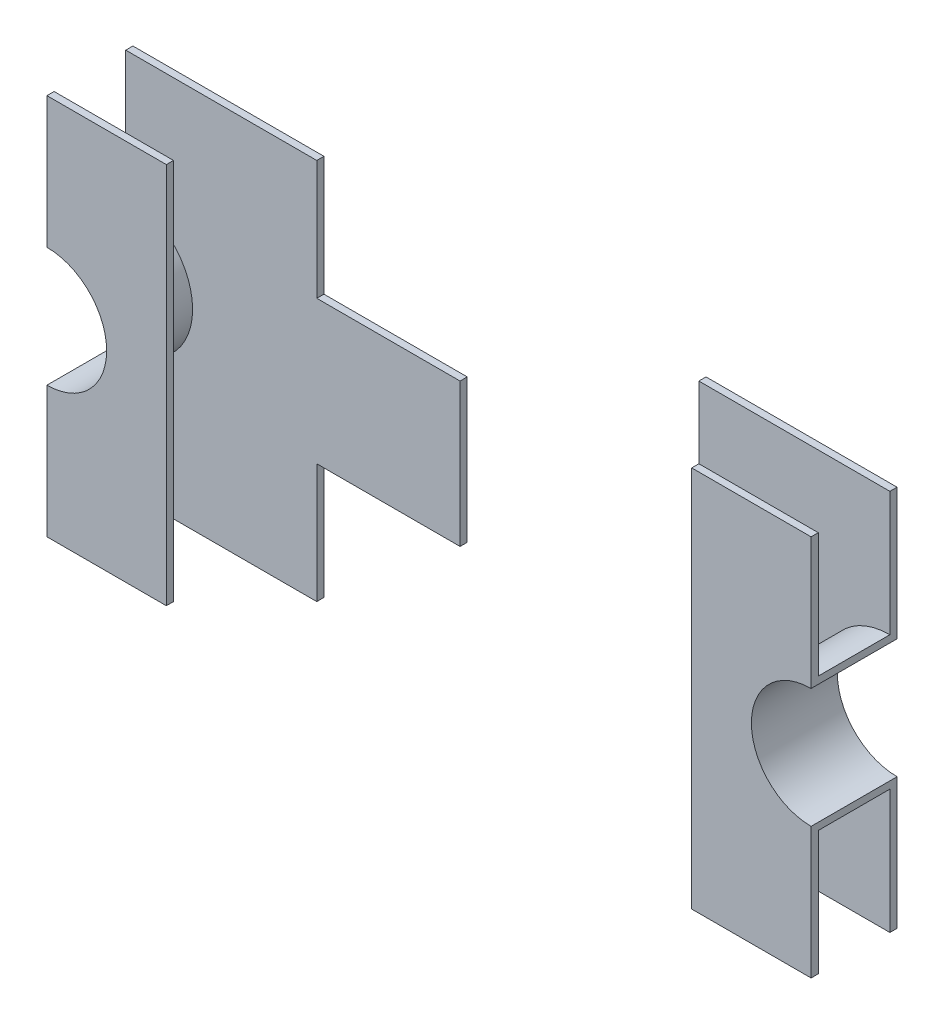
ISO-10303-21;
HEADER;
FILE_DESCRIPTION(('STEP AP214'),'2;1');
FILE_NAME('part.step','',(''),(''),'','','');
FILE_SCHEMA(('AUTOMOTIVE_DESIGN { 1 0 10303 214 1 1 1 1 }'));
ENDSEC;
DATA;
#1=APPLICATION_CONTEXT('core data for automotive mechanical design processes');
#2=APPLICATION_PROTOCOL_DEFINITION('international standard','automotive_design',2000,#1);
#3=PRODUCT_CONTEXT('',#1,'mechanical');
#4=PRODUCT('Part','Part','',(#3));
#5=PRODUCT_RELATED_PRODUCT_CATEGORY('part','',(#4));
#6=PRODUCT_DEFINITION_FORMATION('','',#4);
#7=PRODUCT_DEFINITION_CONTEXT('part definition',#1,'design');
#8=PRODUCT_DEFINITION('design','',#6,#7);
#9=PRODUCT_DEFINITION_SHAPE('','',#8);
#10=(LENGTH_UNIT() NAMED_UNIT(*) SI_UNIT(.MILLI.,.METRE.));
#11=(NAMED_UNIT(*) PLANE_ANGLE_UNIT() SI_UNIT($,.RADIAN.));
#12=(NAMED_UNIT(*) SI_UNIT($,.STERADIAN.) SOLID_ANGLE_UNIT());
#13=UNCERTAINTY_MEASURE_WITH_UNIT(LENGTH_MEASURE(1.E-05),#10,'distance_accuracy_value','');
#14=(GEOMETRIC_REPRESENTATION_CONTEXT(3) GLOBAL_UNCERTAINTY_ASSIGNED_CONTEXT((#13)) GLOBAL_UNIT_ASSIGNED_CONTEXT((#10,
#11,#12)) REPRESENTATION_CONTEXT('',''));
#15=CARTESIAN_POINT('',(0.,0.,0.));
#16=DIRECTION('',(0.,0.,1.));
#17=DIRECTION('',(1.,0.,0.));
#18=AXIS2_PLACEMENT_3D('',#15,#16,#17);
#19=CARTESIAN_POINT('',(0.8,0.,0.18));
#20=DIRECTION('',(1.,0.,0.));
#21=DIRECTION('',(0.,1.,0.));
#22=AXIS2_PLACEMENT_3D('',#19,#20,#21);
#23=PLANE('',#22);
#24=DIRECTION('',(0.,-1.,0.));
#25=VECTOR('',#24,1.);
#26=CARTESIAN_POINT('',(0.8,-0.134798527268,0.01499999999243));
#27=LINE('',#26,#25);
#28=CARTESIAN_POINT('',(0.8,-0.14,0.01499999999243));
#29=VERTEX_POINT('',#28);
#30=CARTESIAN_POINT('',(0.8,-0.4,0.01499999999243));
#31=VERTEX_POINT('',#30);
#32=EDGE_CURVE('P0_E210',#29,#31,#27,.T.);
#33=ORIENTED_EDGE('',*,*,#32,.T.);
#34=DIRECTION('',(0.,0.,1.));
#35=VECTOR('',#34,1.);
#36=CARTESIAN_POINT('',(0.8,-0.4,0.18));
#37=LINE('',#36,#35);
#38=CARTESIAN_POINT('',(0.8,-0.4,0.));
#39=VERTEX_POINT('',#38);
#40=EDGE_CURVE('P0_E202',#39,#31,#37,.T.);
#41=ORIENTED_EDGE('',*,*,#40,.F.);
#42=DIRECTION('',(0.,1.,0.));
#43=VECTOR('',#42,1.);
#44=CARTESIAN_POINT('',(0.8,0.,0.));
#45=LINE('',#44,#43);
#46=CARTESIAN_POINT('',(0.8,-0.125,0.));
#47=VERTEX_POINT('',#46);
#48=EDGE_CURVE('P0_E11',#39,#47,#45,.T.);
#49=ORIENTED_EDGE('',*,*,#48,.T.);
#50=DIRECTION('',(0.,0.,1.));
#51=VECTOR('',#50,1.);
#52=CARTESIAN_POINT('',(0.8,-0.125,0.18));
#53=LINE('',#52,#51);
#54=CARTESIAN_POINT('',(0.8,-0.125,0.18));
#55=VERTEX_POINT('',#54);
#56=EDGE_CURVE('P0_E197',#47,#55,#53,.T.);
#57=ORIENTED_EDGE('',*,*,#56,.T.);
#58=DIRECTION('',(0.,1.,0.));
#59=VECTOR('',#58,1.);
#60=CARTESIAN_POINT('',(0.8,0.,0.18));
#61=LINE('',#60,#59);
#62=CARTESIAN_POINT('',(0.8,-0.4,0.18));
#63=VERTEX_POINT('',#62);
#64=EDGE_CURVE('P0_E215',#63,#55,#61,.T.);
#65=ORIENTED_EDGE('',*,*,#64,.F.);
#66=DIRECTION('',(0.,0.,1.));
#67=VECTOR('',#66,1.);
#68=CARTESIAN_POINT('',(0.8,-0.4,0.18));
#69=LINE('',#68,#67);
#70=CARTESIAN_POINT('',(0.8,-0.4,0.165));
#71=VERTEX_POINT('',#70);
#72=EDGE_CURVE('P0_E283',#71,#63,#69,.T.);
#73=ORIENTED_EDGE('',*,*,#72,.F.);
#74=DIRECTION('',(0.,1.,0.));
#75=VECTOR('',#74,1.);
#76=CARTESIAN_POINT('',(0.8,0.,0.165));
#77=LINE('',#76,#75);
#78=CARTESIAN_POINT('',(0.8,-0.14,0.165));
#79=VERTEX_POINT('',#78);
#80=EDGE_CURVE('P0_E256',#71,#79,#77,.T.);
#81=ORIENTED_EDGE('',*,*,#80,.T.);
#82=DIRECTION('',(0.,0.,-1.));
#83=VECTOR('',#82,1.);
#84=CARTESIAN_POINT('',(0.8,-0.14,0.01499999999243));
#85=LINE('',#84,#83);
#86=EDGE_CURVE('P0_E177',#79,#29,#85,.T.);
#87=ORIENTED_EDGE('',*,*,#86,.T.);
#88=EDGE_LOOP('',(#33,#41,#49,#57,#65,#73,#81,#87));
#89=FACE_BOUND('',#88,.T.);
#90=ADVANCED_FACE('P0_F17',(#89),#23,.T.);
#91=CARTESIAN_POINT('',(0.8,0.,0.));
#92=DIRECTION('',(0.,0.,-1.));
#93=DIRECTION('',(0.,-1.,0.));
#94=AXIS2_PLACEMENT_3D('',#91,#92,#93);
#95=PLANE('',#94);
#96=CARTESIAN_POINT('',(0.8,0.,0.));
#97=DIRECTION('',(0.,0.,1.));
#98=DIRECTION('',(1.,0.,0.));
#99=AXIS2_PLACEMENT_3D('',#96,#97,#98);
#100=CIRCLE('',#99,0.125);
#101=CARTESIAN_POINT('',(0.8,0.125,0.));
#102=VERTEX_POINT('',#101);
#103=EDGE_CURVE('P0_E201',#102,#47,#100,.T.);
#104=ORIENTED_EDGE('',*,*,#103,.T.);
#105=ORIENTED_EDGE('',*,*,#48,.F.);
#106=DIRECTION('',(1.,0.,0.));
#107=VECTOR('',#106,1.);
#108=CARTESIAN_POINT('',(0.8,-0.4,0.));
#109=LINE('',#108,#107);
#110=CARTESIAN_POINT('',(0.4,-0.4,0.));
#111=VERTEX_POINT('',#110);
#112=EDGE_CURVE('P0_E205',#111,#39,#109,.T.);
#113=ORIENTED_EDGE('',*,*,#112,.F.);
#114=DIRECTION('',(0.,1.,0.));
#115=VECTOR('',#114,1.);
#116=CARTESIAN_POINT('',(0.4,0.,0.));
#117=LINE('',#116,#115);
#118=CARTESIAN_POINT('',(0.4,0.4,0.));
#119=VERTEX_POINT('',#118);
#120=EDGE_CURVE('P0_E20',#111,#119,#117,.T.);
#121=ORIENTED_EDGE('',*,*,#120,.T.);
#122=DIRECTION('',(-1.,0.,0.));
#123=VECTOR('',#122,1.);
#124=CARTESIAN_POINT('',(0.8,0.4,0.));
#125=LINE('',#124,#123);
#126=CARTESIAN_POINT('',(0.8,0.4,0.));
#127=VERTEX_POINT('',#126);
#128=EDGE_CURVE('P0_E231',#127,#119,#125,.T.);
#129=ORIENTED_EDGE('',*,*,#128,.F.);
#130=DIRECTION('',(0.,1.,0.));
#131=VECTOR('',#130,1.);
#132=CARTESIAN_POINT('',(0.8,0.,0.));
#133=LINE('',#132,#131);
#134=EDGE_CURVE('P0_E188',#102,#127,#133,.T.);
#135=ORIENTED_EDGE('',*,*,#134,.F.);
#136=EDGE_LOOP('',(#104,#105,#113,#121,#129,#135));
#137=FACE_BOUND('',#136,.T.);
#138=ADVANCED_FACE('P0_F227',(#137),#95,.T.);
#139=CARTESIAN_POINT('',(0.4,0.,0.));
#140=DIRECTION('',(-1.,0.,0.));
#141=DIRECTION('',(0.,0.,1.));
#142=AXIS2_PLACEMENT_3D('',#139,#140,#141);
#143=PLANE('',#142);
#144=DIRECTION('',(0.,1.,0.));
#145=VECTOR('',#144,1.);
#146=CARTESIAN_POINT('',(0.4,0.,0.01499999999243));
#147=LINE('',#146,#145);
#148=CARTESIAN_POINT('',(0.4,-0.4,0.01499999999243));
#149=VERTEX_POINT('',#148);
#150=CARTESIAN_POINT('',(0.4,0.4,0.01499999999243));
#151=VERTEX_POINT('',#150);
#152=EDGE_CURVE('P0_E211',#149,#151,#147,.T.);
#153=ORIENTED_EDGE('',*,*,#152,.T.);
#154=DIRECTION('',(0.,0.,1.));
#155=VECTOR('',#154,1.);
#156=CARTESIAN_POINT('',(0.4,0.4,-0.547241434602));
#157=LINE('',#156,#155);
#158=EDGE_CURVE('P0_E235',#119,#151,#157,.T.);
#159=ORIENTED_EDGE('',*,*,#158,.F.);
#160=ORIENTED_EDGE('',*,*,#120,.F.);
#161=DIRECTION('',(0.,0.,-1.));
#162=VECTOR('',#161,1.);
#163=CARTESIAN_POINT('',(0.4,-0.4,-0.547241434602));
#164=LINE('',#163,#162);
#165=EDGE_CURVE('P0_E218',#149,#111,#164,.T.);
#166=ORIENTED_EDGE('',*,*,#165,.F.);
#167=EDGE_LOOP('',(#153,#159,#160,#166));
#168=FACE_BOUND('',#167,.T.);
#169=ADVANCED_FACE('P0_F236',(#168),#143,.T.);
#170=CARTESIAN_POINT('',(0.6,-0.4,0.09));
#171=DIRECTION('',(0.,-1.,0.));
#172=DIRECTION('',(0.,0.,-1.));
#173=AXIS2_PLACEMENT_3D('',#170,#171,#172);
#174=PLANE('',#173);
#175=DIRECTION('',(-1.,0.,0.));
#176=VECTOR('',#175,1.);
#177=CARTESIAN_POINT('',(0.696250000004,-0.4,0.01499999999243));
#178=LINE('',#177,#176);
#179=EDGE_CURVE('P0_E206',#31,#149,#178,.T.);
#180=ORIENTED_EDGE('',*,*,#179,.T.);
#181=ORIENTED_EDGE('',*,*,#165,.T.);
#182=ORIENTED_EDGE('',*,*,#112,.T.);
#183=ORIENTED_EDGE('',*,*,#40,.T.);
#184=EDGE_LOOP('',(#180,#181,#182,#183));
#185=FACE_BOUND('',#184,.T.);
#186=ADVANCED_FACE('P0_F226',(#185),#174,.T.);
#187=CARTESIAN_POINT('',(0.4,0.,0.18));
#188=DIRECTION('',(0.,0.,1.));
#189=DIRECTION('',(1.,0.,0.));
#190=AXIS2_PLACEMENT_3D('',#187,#188,#189);
#191=PLANE('',#190);
#192=DIRECTION('',(0.,-1.,0.));
#193=VECTOR('',#192,1.);
#194=CARTESIAN_POINT('',(0.55,0.32830613052,0.18));
#195=LINE('',#194,#193);
#196=CARTESIAN_POINT('',(0.55,0.4,0.18));
#197=VERTEX_POINT('',#196);
#198=CARTESIAN_POINT('',(0.55,-0.4,0.18));
#199=VERTEX_POINT('',#198);
#200=EDGE_CURVE('P0_E242',#197,#199,#195,.T.);
#201=ORIENTED_EDGE('',*,*,#200,.T.);
#202=DIRECTION('',(-1.,0.,0.));
#203=VECTOR('',#202,1.);
#204=CARTESIAN_POINT('',(-0.8,-0.4,0.18));
#205=LINE('',#204,#203);
#206=EDGE_CURVE('P0_E272',#63,#199,#205,.T.);
#207=ORIENTED_EDGE('',*,*,#206,.F.);
#208=ORIENTED_EDGE('',*,*,#64,.T.);
#209=CARTESIAN_POINT('',(0.8,0.,0.18));
#210=DIRECTION('',(0.,0.,-1.));
#211=DIRECTION('',(1.,0.,0.));
#212=AXIS2_PLACEMENT_3D('',#209,#210,#211);
#213=CIRCLE('',#212,0.125);
#214=CARTESIAN_POINT('',(0.8,0.125,0.18));
#215=VERTEX_POINT('',#214);
#216=EDGE_CURVE('P0_E194',#55,#215,#213,.T.);
#217=ORIENTED_EDGE('',*,*,#216,.T.);
#218=DIRECTION('',(0.,1.,0.));
#219=VECTOR('',#218,1.);
#220=CARTESIAN_POINT('',(0.8,0.,0.18));
#221=LINE('',#220,#219);
#222=CARTESIAN_POINT('',(0.8,0.4,0.18));
#223=VERTEX_POINT('',#222);
#224=EDGE_CURVE('P0_E181',#215,#223,#221,.T.);
#225=ORIENTED_EDGE('',*,*,#224,.T.);
#226=DIRECTION('',(1.,0.,0.));
#227=VECTOR('',#226,1.);
#228=CARTESIAN_POINT('',(-0.8,0.4,0.18));
#229=LINE('',#228,#227);
#230=EDGE_CURVE('P0_E141',#197,#223,#229,.T.);
#231=ORIENTED_EDGE('',*,*,#230,.F.);
#232=EDGE_LOOP('',(#201,#207,#208,#217,#225,#231));
#233=FACE_BOUND('',#232,.T.);
#234=ADVANCED_FACE('P0_F271',(#233),#191,.T.);
#235=CARTESIAN_POINT('',(0.4,0.,0.01499999999243));
#236=DIRECTION('',(0.,0.,1.));
#237=DIRECTION('',(1.,0.,0.));
#238=AXIS2_PLACEMENT_3D('',#235,#236,#237);
#239=PLANE('',#238);
#240=CARTESIAN_POINT('',(0.8,0.,0.01499999999243));
#241=DIRECTION('',(0.,0.,1.));
#242=DIRECTION('',(1.,0.,0.));
#243=AXIS2_PLACEMENT_3D('',#240,#241,#242);
#244=CIRCLE('',#243,0.14);
#245=CARTESIAN_POINT('',(0.8,0.14,0.01499999999243));
#246=VERTEX_POINT('',#245);
#247=EDGE_CURVE('P0_E173',#246,#29,#244,.T.);
#248=ORIENTED_EDGE('',*,*,#247,.F.);
#249=DIRECTION('',(0.,-1.,0.));
#250=VECTOR('',#249,1.);
#251=CARTESIAN_POINT('',(0.8,0.134798527268,0.01499999999243));
#252=LINE('',#251,#250);
#253=CARTESIAN_POINT('',(0.8,0.4,0.01499999999243));
#254=VERTEX_POINT('',#253);
#255=EDGE_CURVE('P0_E191',#254,#246,#252,.T.);
#256=ORIENTED_EDGE('',*,*,#255,.F.);
#257=DIRECTION('',(1.,0.,0.));
#258=VECTOR('',#257,1.);
#259=CARTESIAN_POINT('',(-0.785000000016,0.4,0.01499999999243));
#260=LINE('',#259,#258);
#261=EDGE_CURVE('P0_E252',#151,#254,#260,.T.);
#262=ORIENTED_EDGE('',*,*,#261,.F.);
#263=ORIENTED_EDGE('',*,*,#152,.F.);
#264=ORIENTED_EDGE('',*,*,#179,.F.);
#265=ORIENTED_EDGE('',*,*,#32,.F.);
#266=EDGE_LOOP('',(#248,#256,#262,#263,#264,#265));
#267=FACE_BOUND('',#266,.T.);
#268=ADVANCED_FACE('P0_F310',(#267),#239,.T.);
#269=CARTESIAN_POINT('',(0.8,0.,0.18));
#270=DIRECTION('',(0.,0.,-1.));
#271=DIRECTION('',(-1.,0.,0.));
#272=AXIS2_PLACEMENT_3D('',#269,#270,#271);
#273=CYLINDRICAL_SURFACE('',#272,0.125);
#274=DIRECTION('',(0.,0.,-1.));
#275=VECTOR('',#274,1.);
#276=CARTESIAN_POINT('',(0.8,0.125,0.18));
#277=LINE('',#276,#275);
#278=EDGE_CURVE('P0_E184',#215,#102,#277,.T.);
#279=ORIENTED_EDGE('',*,*,#278,.F.);
#280=ORIENTED_EDGE('',*,*,#216,.F.);
#281=ORIENTED_EDGE('',*,*,#56,.F.);
#282=ORIENTED_EDGE('',*,*,#103,.F.);
#283=EDGE_LOOP('',(#279,#280,#281,#282));
#284=FACE_BOUND('',#283,.T.);
#285=ADVANCED_FACE('P0_F304',(#284),#273,.F.);
#286=CARTESIAN_POINT('',(0.8,0.,0.18));
#287=DIRECTION('',(1.,0.,0.));
#288=DIRECTION('',(0.,1.,0.));
#289=AXIS2_PLACEMENT_3D('',#286,#287,#288);
#290=PLANE('',#289);
#291=DIRECTION('',(0.,1.,0.));
#292=VECTOR('',#291,1.);
#293=CARTESIAN_POINT('',(0.8,0.,0.165));
#294=LINE('',#293,#292);
#295=CARTESIAN_POINT('',(0.8,0.14,0.165));
#296=VERTEX_POINT('',#295);
#297=CARTESIAN_POINT('',(0.8,0.4,0.165));
#298=VERTEX_POINT('',#297);
#299=EDGE_CURVE('P0_E148',#296,#298,#294,.T.);
#300=ORIENTED_EDGE('',*,*,#299,.T.);
#301=DIRECTION('',(0.,0.,-1.));
#302=VECTOR('',#301,1.);
#303=CARTESIAN_POINT('',(0.8,0.4,0.18));
#304=LINE('',#303,#302);
#305=EDGE_CURVE('P0_E134',#223,#298,#304,.T.);
#306=ORIENTED_EDGE('',*,*,#305,.F.);
#307=ORIENTED_EDGE('',*,*,#224,.F.);
#308=ORIENTED_EDGE('',*,*,#278,.T.);
#309=ORIENTED_EDGE('',*,*,#134,.T.);
#310=DIRECTION('',(0.,0.,-1.));
#311=VECTOR('',#310,1.);
#312=CARTESIAN_POINT('',(0.8,0.4,0.18));
#313=LINE('',#312,#311);
#314=EDGE_CURVE('P0_E246',#254,#127,#313,.T.);
#315=ORIENTED_EDGE('',*,*,#314,.F.);
#316=ORIENTED_EDGE('',*,*,#255,.T.);
#317=DIRECTION('',(0.,0.,1.));
#318=VECTOR('',#317,1.);
#319=CARTESIAN_POINT('',(0.8,0.14,0.01499999999243));
#320=LINE('',#319,#318);
#321=EDGE_CURVE('P0_E145',#246,#296,#320,.T.);
#322=ORIENTED_EDGE('',*,*,#321,.T.);
#323=EDGE_LOOP('',(#300,#306,#307,#308,#309,#315,#316,#322));
#324=FACE_BOUND('',#323,.T.);
#325=ADVANCED_FACE('P0_F149',(#324),#290,.T.);
#326=CARTESIAN_POINT('',(0.8,0.,0.18));
#327=DIRECTION('',(0.,0.,-1.));
#328=DIRECTION('',(0.,1.,0.));
#329=AXIS2_PLACEMENT_3D('',#326,#327,#328);
#330=CYLINDRICAL_SURFACE('',#329,0.14);
#331=CARTESIAN_POINT('',(0.8,0.,0.16499999999));
#332=DIRECTION('',(0.,0.,1.));
#333=DIRECTION('',(0.,1.,0.));
#334=AXIS2_PLACEMENT_3D('',#331,#332,#333);
#335=CIRCLE('',#334,0.14);
#336=EDGE_CURVE('P0_E155',#296,#79,#335,.T.);
#337=ORIENTED_EDGE('',*,*,#336,.F.);
#338=ORIENTED_EDGE('',*,*,#321,.F.);
#339=ORIENTED_EDGE('',*,*,#247,.T.);
#340=ORIENTED_EDGE('',*,*,#86,.F.);
#341=EDGE_LOOP('',(#337,#338,#339,#340));
#342=FACE_BOUND('',#341,.T.);
#343=ADVANCED_FACE('P0_F312',(#342),#330,.T.);
#344=CARTESIAN_POINT('',(0.6,0.4,0.09));
#345=DIRECTION('',(0.,1.,0.));
#346=DIRECTION('',(1.,0.,0.));
#347=AXIS2_PLACEMENT_3D('',#344,#345,#346);
#348=PLANE('',#347);
#349=DIRECTION('',(-1.,0.,0.));
#350=VECTOR('',#349,1.);
#351=CARTESIAN_POINT('',(0.696250000004,0.4,0.165));
#352=LINE('',#351,#350);
#353=CARTESIAN_POINT('',(0.55,0.4,0.16499999999));
#354=VERTEX_POINT('',#353);
#355=EDGE_CURVE('P0_E139',#298,#354,#352,.T.);
#356=ORIENTED_EDGE('',*,*,#355,.T.);
#357=DIRECTION('',(0.,0.,1.));
#358=VECTOR('',#357,1.);
#359=CARTESIAN_POINT('',(0.55,0.4,0.135));
#360=LINE('',#359,#358);
#361=EDGE_CURVE('P0_E167',#354,#197,#360,.T.);
#362=ORIENTED_EDGE('',*,*,#361,.T.);
#363=ORIENTED_EDGE('',*,*,#230,.T.);
#364=ORIENTED_EDGE('',*,*,#305,.T.);
#365=EDGE_LOOP('',(#356,#362,#363,#364));
#366=FACE_BOUND('',#365,.T.);
#367=ADVANCED_FACE('P0_F136',(#366),#348,.T.);
#368=CARTESIAN_POINT('',(0.785000000016,0.,0.16499999999));
#369=DIRECTION('',(0.,0.,-1.));
#370=DIRECTION('',(0.,-1.,0.));
#371=AXIS2_PLACEMENT_3D('',#368,#369,#370);
#372=PLANE('',#371);
#373=DIRECTION('',(0.,1.,0.));
#374=VECTOR('',#373,1.);
#375=CARTESIAN_POINT('',(0.55,0.32830613052,0.16499999999));
#376=LINE('',#375,#374);
#377=CARTESIAN_POINT('',(0.55,-0.4,0.165));
#378=VERTEX_POINT('',#377);
#379=EDGE_CURVE('P0_E159',#378,#354,#376,.T.);
#380=ORIENTED_EDGE('',*,*,#379,.T.);
#381=ORIENTED_EDGE('',*,*,#355,.F.);
#382=ORIENTED_EDGE('',*,*,#299,.F.);
#383=ORIENTED_EDGE('',*,*,#336,.T.);
#384=ORIENTED_EDGE('',*,*,#80,.F.);
#385=DIRECTION('',(1.,0.,0.));
#386=VECTOR('',#385,1.);
#387=CARTESIAN_POINT('',(0.785000000016,-0.4,0.16499999999));
#388=LINE('',#387,#386);
#389=EDGE_CURVE('P0_E285',#378,#71,#388,.T.);
#390=ORIENTED_EDGE('',*,*,#389,.F.);
#391=EDGE_LOOP('',(#380,#381,#382,#383,#384,#390));
#392=FACE_BOUND('',#391,.T.);
#393=ADVANCED_FACE('P0_F157',(#392),#372,.T.);
#394=CARTESIAN_POINT('',(0.55,0.65661226104,0.18));
#395=DIRECTION('',(1.,0.,0.));
#396=DIRECTION('',(0.,1.,0.));
#397=AXIS2_PLACEMENT_3D('',#394,#395,#396);
#398=PLANE('',#397);
#399=DIRECTION('',(0.,0.,-1.));
#400=VECTOR('',#399,1.);
#401=CARTESIAN_POINT('',(0.55,-0.4,0.135));
#402=LINE('',#401,#400);
#403=EDGE_CURVE('P0_E267',#199,#378,#402,.T.);
#404=ORIENTED_EDGE('',*,*,#403,.F.);
#405=ORIENTED_EDGE('',*,*,#200,.F.);
#406=ORIENTED_EDGE('',*,*,#361,.F.);
#407=ORIENTED_EDGE('',*,*,#379,.F.);
#408=EDGE_LOOP('',(#404,#405,#406,#407));
#409=FACE_BOUND('',#408,.T.);
#410=ADVANCED_FACE('P0_F265',(#409),#398,.F.);
#411=CARTESIAN_POINT('',(0.6,0.4,0.09));
#412=DIRECTION('',(0.,1.,0.));
#413=DIRECTION('',(1.,0.,0.));
#414=AXIS2_PLACEMENT_3D('',#411,#412,#413);
#415=PLANE('',#414);
#416=ORIENTED_EDGE('',*,*,#261,.T.);
#417=ORIENTED_EDGE('',*,*,#314,.T.);
#418=ORIENTED_EDGE('',*,*,#128,.T.);
#419=ORIENTED_EDGE('',*,*,#158,.T.);
#420=EDGE_LOOP('',(#416,#417,#418,#419));
#421=FACE_BOUND('',#420,.T.);
#422=ADVANCED_FACE('P0_F244',(#421),#415,.T.);
#423=CARTESIAN_POINT('',(0.6,-0.4,0.09));
#424=DIRECTION('',(0.,-1.,0.));
#425=DIRECTION('',(0.,0.,-1.));
#426=AXIS2_PLACEMENT_3D('',#423,#424,#425);
#427=PLANE('',#426);
#428=ORIENTED_EDGE('',*,*,#389,.T.);
#429=ORIENTED_EDGE('',*,*,#72,.T.);
#430=ORIENTED_EDGE('',*,*,#206,.T.);
#431=ORIENTED_EDGE('',*,*,#403,.T.);
#432=EDGE_LOOP('',(#428,#429,#430,#431));
#433=FACE_BOUND('',#432,.T.);
#434=ADVANCED_FACE('P0_F315',(#433),#427,.T.);
#435=CLOSED_SHELL('',(#90,#138,#169,#186,#234,#268,#285,#325,#343,#367,#393,#410,#422,#434));
#436=MANIFOLD_SOLID_BREP('P0_B1',#435);
#437=CARTESIAN_POINT('',(-0.55,-0.65661226104,0.18));
#438=DIRECTION('',(-1.,0.,0.));
#439=DIRECTION('',(0.,0.,1.));
#440=AXIS2_PLACEMENT_3D('',#437,#438,#439);
#441=PLANE('',#440);
#442=DIRECTION('',(0.,0.,-1.));
#443=VECTOR('',#442,1.);
#444=CARTESIAN_POINT('',(-0.55,0.4,0.135));
#445=LINE('',#444,#443);
#446=CARTESIAN_POINT('',(-0.55,0.4,0.18));
#447=VERTEX_POINT('',#446);
#448=CARTESIAN_POINT('',(-0.55,0.4,0.16499999999));
#449=VERTEX_POINT('',#448);
#450=EDGE_CURVE('P1_E227',#447,#449,#445,.T.);
#451=ORIENTED_EDGE('',*,*,#450,.F.);
#452=DIRECTION('',(0.,1.,0.));
#453=VECTOR('',#452,1.);
#454=CARTESIAN_POINT('',(-0.55,-0.32830613052,0.18));
#455=LINE('',#454,#453);
#456=CARTESIAN_POINT('',(-0.55,-0.4,0.18));
#457=VERTEX_POINT('',#456);
#458=EDGE_CURVE('P1_E149',#457,#447,#455,.T.);
#459=ORIENTED_EDGE('',*,*,#458,.F.);
#460=DIRECTION('',(0.,0.,1.));
#461=VECTOR('',#460,1.);
#462=CARTESIAN_POINT('',(-0.55,-0.4,0.135));
#463=LINE('',#462,#461);
#464=CARTESIAN_POINT('',(-0.55,-0.4,0.165));
#465=VERTEX_POINT('',#464);
#466=EDGE_CURVE('P1_E20',#465,#457,#463,.T.);
#467=ORIENTED_EDGE('',*,*,#466,.F.);
#468=DIRECTION('',(0.,-1.,0.));
#469=VECTOR('',#468,1.);
#470=CARTESIAN_POINT('',(-0.55,-0.32830613052,0.16499999999));
#471=LINE('',#470,#469);
#472=EDGE_CURVE('P1_E11',#449,#465,#471,.T.);
#473=ORIENTED_EDGE('',*,*,#472,.F.);
#474=EDGE_LOOP('',(#451,#459,#467,#473));
#475=FACE_BOUND('',#474,.T.);
#476=ADVANCED_FACE('P1_F17',(#475),#441,.F.);
#477=CARTESIAN_POINT('',(-0.785000000016,0.,0.16499999999));
#478=DIRECTION('',(0.,0.,1.));
#479=DIRECTION('',(1.,0.,0.));
#480=AXIS2_PLACEMENT_3D('',#477,#478,#479);
#481=PLANE('',#480);
#482=ORIENTED_EDGE('',*,*,#472,.T.);
#483=DIRECTION('',(1.,0.,0.));
#484=VECTOR('',#483,1.);
#485=CARTESIAN_POINT('',(-0.696250000004,-0.4,0.165));
#486=LINE('',#485,#484);
#487=CARTESIAN_POINT('',(-0.8,-0.4,0.165));
#488=VERTEX_POINT('',#487);
#489=EDGE_CURVE('P1_E204',#488,#465,#486,.T.);
#490=ORIENTED_EDGE('',*,*,#489,.F.);
#491=DIRECTION('',(0.,-1.,0.));
#492=VECTOR('',#491,1.);
#493=CARTESIAN_POINT('',(-0.8,0.,0.165));
#494=LINE('',#493,#492);
#495=CARTESIAN_POINT('',(-0.8,-0.14,0.165));
#496=VERTEX_POINT('',#495);
#497=EDGE_CURVE('P1_E188',#496,#488,#494,.T.);
#498=ORIENTED_EDGE('',*,*,#497,.F.);
#499=CARTESIAN_POINT('',(-0.8,0.,0.165));
#500=DIRECTION('',(0.,0.,1.));
#501=DIRECTION('',(-1.,0.,0.));
#502=AXIS2_PLACEMENT_3D('',#499,#500,#501);
#503=CIRCLE('',#502,0.14);
#504=CARTESIAN_POINT('',(-0.8,0.14,0.165));
#505=VERTEX_POINT('',#504);
#506=EDGE_CURVE('P1_E86',#496,#505,#503,.T.);
#507=ORIENTED_EDGE('',*,*,#506,.T.);
#508=DIRECTION('',(0.,-1.,0.));
#509=VECTOR('',#508,1.);
#510=CARTESIAN_POINT('',(-0.8,0.,0.165));
#511=LINE('',#510,#509);
#512=CARTESIAN_POINT('',(-0.8,0.4,0.165));
#513=VERTEX_POINT('',#512);
#514=EDGE_CURVE('P1_E311',#513,#505,#511,.T.);
#515=ORIENTED_EDGE('',*,*,#514,.F.);
#516=DIRECTION('',(1.,0.,0.));
#517=VECTOR('',#516,1.);
#518=CARTESIAN_POINT('',(-0.785000000016,0.4,0.16499999999));
#519=LINE('',#518,#517);
#520=EDGE_CURVE('P1_E245',#513,#449,#519,.T.);
#521=ORIENTED_EDGE('',*,*,#520,.T.);
#522=EDGE_LOOP('',(#482,#490,#498,#507,#515,#521));
#523=FACE_BOUND('',#522,.T.);
#524=ADVANCED_FACE('P1_F420',(#523),#481,.F.);
#525=CARTESIAN_POINT('',(-0.6,-0.4,0.09));
#526=DIRECTION('',(0.,1.,0.));
#527=DIRECTION('',(1.,0.,0.));
#528=AXIS2_PLACEMENT_3D('',#525,#526,#527);
#529=PLANE('',#528);
#530=ORIENTED_EDGE('',*,*,#489,.T.);
#531=ORIENTED_EDGE('',*,*,#466,.T.);
#532=DIRECTION('',(1.,0.,0.));
#533=VECTOR('',#532,1.);
#534=CARTESIAN_POINT('',(0.8,-0.4,0.18));
#535=LINE('',#534,#533);
#536=CARTESIAN_POINT('',(-0.8,-0.4,0.18));
#537=VERTEX_POINT('',#536);
#538=EDGE_CURVE('P1_E177',#537,#457,#535,.T.);
#539=ORIENTED_EDGE('',*,*,#538,.F.);
#540=DIRECTION('',(0.,0.,1.));
#541=VECTOR('',#540,1.);
#542=CARTESIAN_POINT('',(-0.8,-0.4,0.18));
#543=LINE('',#542,#541);
#544=EDGE_CURVE('P1_E193',#488,#537,#543,.T.);
#545=ORIENTED_EDGE('',*,*,#544,.F.);
#546=EDGE_LOOP('',(#530,#531,#539,#545));
#547=FACE_BOUND('',#546,.T.);
#548=ADVANCED_FACE('P1_F218',(#547),#529,.F.);
#549=CARTESIAN_POINT('',(-0.1,0.15,0.));
#550=DIRECTION('',(0.,1.,0.));
#551=DIRECTION('',(1.,0.,0.));
#552=AXIS2_PLACEMENT_3D('',#549,#550,#551);
#553=PLANE('',#552);
#554=DIRECTION('',(1.,0.,0.));
#555=VECTOR('',#554,1.);
#556=CARTESIAN_POINT('',(-0.7,0.15,0.));
#557=LINE('',#556,#555);
#558=CARTESIAN_POINT('',(-0.4,0.15,0.));
#559=VERTEX_POINT('',#558);
#560=CARTESIAN_POINT('',(-0.1,0.15,0.));
#561=VERTEX_POINT('',#560);
#562=EDGE_CURVE('P1_E263',#559,#561,#557,.T.);
#563=ORIENTED_EDGE('',*,*,#562,.F.);
#564=DIRECTION('',(0.,0.,-1.));
#565=VECTOR('',#564,1.);
#566=CARTESIAN_POINT('',(-0.4,0.15,0.));
#567=LINE('',#566,#565);
#568=CARTESIAN_POINT('',(-0.4,0.15,0.015));
#569=VERTEX_POINT('',#568);
#570=EDGE_CURVE('P1_E75',#569,#559,#567,.T.);
#571=ORIENTED_EDGE('',*,*,#570,.F.);
#572=DIRECTION('',(-1.,0.,0.));
#573=VECTOR('',#572,1.);
#574=CARTESIAN_POINT('',(-0.7,0.15,0.015));
#575=LINE('',#574,#573);
#576=CARTESIAN_POINT('',(-0.1,0.15,0.015));
#577=VERTEX_POINT('',#576);
#578=EDGE_CURVE('P1_E184',#577,#569,#575,.T.);
#579=ORIENTED_EDGE('',*,*,#578,.F.);
#580=DIRECTION('',(0.,0.,1.));
#581=VECTOR('',#580,1.);
#582=CARTESIAN_POINT('',(-0.1,0.15,0.));
#583=LINE('',#582,#581);
#584=EDGE_CURVE('P1_E201',#561,#577,#583,.T.);
#585=ORIENTED_EDGE('',*,*,#584,.F.);
#586=EDGE_LOOP('',(#563,#571,#579,#585));
#587=FACE_BOUND('',#586,.T.);
#588=ADVANCED_FACE('P1_F427',(#587),#553,.T.);
#589=CARTESIAN_POINT('',(-0.1,-0.15,0.));
#590=DIRECTION('',(1.,0.,0.));
#591=DIRECTION('',(0.,1.,0.));
#592=AXIS2_PLACEMENT_3D('',#589,#590,#591);
#593=PLANE('',#592);
#594=DIRECTION('',(0.,-1.,0.));
#595=VECTOR('',#594,1.);
#596=CARTESIAN_POINT('',(-0.1,0.15,0.));
#597=LINE('',#596,#595);
#598=CARTESIAN_POINT('',(-0.1,-0.15,0.));
#599=VERTEX_POINT('',#598);
#600=EDGE_CURVE('P1_E267',#561,#599,#597,.T.);
#601=ORIENTED_EDGE('',*,*,#600,.F.);
#602=ORIENTED_EDGE('',*,*,#584,.T.);
#603=DIRECTION('',(0.,1.,0.));
#604=VECTOR('',#603,1.);
#605=CARTESIAN_POINT('',(-0.1,0.15,0.015));
#606=LINE('',#605,#604);
#607=CARTESIAN_POINT('',(-0.1,-0.15,0.015));
#608=VERTEX_POINT('',#607);
#609=EDGE_CURVE('P1_E133',#608,#577,#606,.T.);
#610=ORIENTED_EDGE('',*,*,#609,.F.);
#611=DIRECTION('',(0.,0.,1.));
#612=VECTOR('',#611,1.);
#613=CARTESIAN_POINT('',(-0.1,-0.15,0.));
#614=LINE('',#613,#612);
#615=EDGE_CURVE('P1_E128',#599,#608,#614,.T.);
#616=ORIENTED_EDGE('',*,*,#615,.F.);
#617=EDGE_LOOP('',(#601,#602,#610,#616));
#618=FACE_BOUND('',#617,.T.);
#619=ADVANCED_FACE('P1_F283',(#618),#593,.T.);
#620=CARTESIAN_POINT('',(-0.4,-0.15,0.));
#621=DIRECTION('',(0.,-1.,0.));
#622=DIRECTION('',(0.,0.,-1.));
#623=AXIS2_PLACEMENT_3D('',#620,#621,#622);
#624=PLANE('',#623);
#625=DIRECTION('',(-1.,0.,0.));
#626=VECTOR('',#625,1.);
#627=CARTESIAN_POINT('',(-0.1,-0.15,0.));
#628=LINE('',#627,#626);
#629=CARTESIAN_POINT('',(-0.4,-0.15,0.));
#630=VERTEX_POINT('',#629);
#631=EDGE_CURVE('P1_E256',#599,#630,#628,.T.);
#632=ORIENTED_EDGE('',*,*,#631,.F.);
#633=ORIENTED_EDGE('',*,*,#615,.T.);
#634=DIRECTION('',(1.,0.,0.));
#635=VECTOR('',#634,1.);
#636=CARTESIAN_POINT('',(-0.1,-0.15,0.015));
#637=LINE('',#636,#635);
#638=CARTESIAN_POINT('',(-0.4,-0.15,0.015));
#639=VERTEX_POINT('',#638);
#640=EDGE_CURVE('P1_E125',#639,#608,#637,.T.);
#641=ORIENTED_EDGE('',*,*,#640,.F.);
#642=DIRECTION('',(0.,0.,1.));
#643=VECTOR('',#642,1.);
#644=CARTESIAN_POINT('',(-0.4,-0.15,0.));
#645=LINE('',#644,#643);
#646=EDGE_CURVE('P1_E121',#630,#639,#645,.T.);
#647=ORIENTED_EDGE('',*,*,#646,.F.);
#648=EDGE_LOOP('',(#632,#633,#641,#647));
#649=FACE_BOUND('',#648,.T.);
#650=ADVANCED_FACE('P1_F127',(#649),#624,.T.);
#651=CARTESIAN_POINT('',(-0.4,0.,0.));
#652=DIRECTION('',(-1.,0.,0.));
#653=DIRECTION('',(0.,1.,0.));
#654=AXIS2_PLACEMENT_3D('',#651,#652,#653);
#655=PLANE('',#654);
#656=ORIENTED_EDGE('',*,*,#570,.T.);
#657=DIRECTION('',(0.,1.,0.));
#658=VECTOR('',#657,1.);
#659=CARTESIAN_POINT('',(-0.4,0.,0.));
#660=LINE('',#659,#658);
#661=CARTESIAN_POINT('',(-0.4,0.4,0.));
#662=VERTEX_POINT('',#661);
#663=EDGE_CURVE('P1_E260',#559,#662,#660,.T.);
#664=ORIENTED_EDGE('',*,*,#663,.T.);
#665=DIRECTION('',(0.,0.,1.));
#666=VECTOR('',#665,1.);
#667=CARTESIAN_POINT('',(-0.4,0.4,-0.547241434602));
#668=LINE('',#667,#666);
#669=CARTESIAN_POINT('',(-0.4,0.4,0.01499999999243));
#670=VERTEX_POINT('',#669);
#671=EDGE_CURVE('P1_E301',#662,#670,#668,.T.);
#672=ORIENTED_EDGE('',*,*,#671,.T.);
#673=DIRECTION('',(0.,1.,0.));
#674=VECTOR('',#673,1.);
#675=CARTESIAN_POINT('',(-0.4,0.,0.01499999999243));
#676=LINE('',#675,#674);
#677=EDGE_CURVE('P1_E189',#569,#670,#676,.T.);
#678=ORIENTED_EDGE('',*,*,#677,.F.);
#679=EDGE_LOOP('',(#656,#664,#672,#678));
#680=FACE_BOUND('',#679,.T.);
#681=ADVANCED_FACE('P1_F356',(#680),#655,.F.);
#682=CARTESIAN_POINT('',(-0.8,0.,0.18));
#683=DIRECTION('',(0.,0.,1.));
#684=DIRECTION('',(0.,1.,0.));
#685=AXIS2_PLACEMENT_3D('',#682,#683,#684);
#686=CYLINDRICAL_SURFACE('',#685,0.14);
#687=ORIENTED_EDGE('',*,*,#506,.F.);
#688=DIRECTION('',(0.,0.,1.));
#689=VECTOR('',#688,1.);
#690=CARTESIAN_POINT('',(-0.8,-0.14,0.01499999999243));
#691=LINE('',#690,#689);
#692=CARTESIAN_POINT('',(-0.8,-0.14,0.01499999999243));
#693=VERTEX_POINT('',#692);
#694=EDGE_CURVE('P1_E196',#693,#496,#691,.T.);
#695=ORIENTED_EDGE('',*,*,#694,.F.);
#696=CARTESIAN_POINT('',(-0.8,0.,0.01499999999243));
#697=DIRECTION('',(0.,0.,-1.));
#698=DIRECTION('',(0.,1.,0.));
#699=AXIS2_PLACEMENT_3D('',#696,#697,#698);
#700=CIRCLE('',#699,0.14);
#701=CARTESIAN_POINT('',(-0.8,0.14,0.01499999999243));
#702=VERTEX_POINT('',#701);
#703=EDGE_CURVE('P1_E180',#702,#693,#700,.T.);
#704=ORIENTED_EDGE('',*,*,#703,.F.);
#705=DIRECTION('',(0.,0.,-1.));
#706=VECTOR('',#705,1.);
#707=CARTESIAN_POINT('',(-0.8,0.14,0.01499999999243));
#708=LINE('',#707,#706);
#709=EDGE_CURVE('P1_E315',#505,#702,#708,.T.);
#710=ORIENTED_EDGE('',*,*,#709,.F.);
#711=EDGE_LOOP('',(#687,#695,#704,#710));
#712=FACE_BOUND('',#711,.T.);
#713=ADVANCED_FACE('P1_F436',(#712),#686,.T.);
#714=CARTESIAN_POINT('',(-0.8,0.,0.18));
#715=DIRECTION('',(1.,0.,0.));
#716=DIRECTION('',(0.,1.,0.));
#717=AXIS2_PLACEMENT_3D('',#714,#715,#716);
#718=PLANE('',#717);
#719=ORIENTED_EDGE('',*,*,#497,.T.);
#720=ORIENTED_EDGE('',*,*,#544,.T.);
#721=DIRECTION('',(0.,1.,0.));
#722=VECTOR('',#721,1.);
#723=CARTESIAN_POINT('',(-0.8,0.,0.18));
#724=LINE('',#723,#722);
#725=CARTESIAN_POINT('',(-0.8,-0.125,0.18));
#726=VERTEX_POINT('',#725);
#727=EDGE_CURVE('P1_E173',#537,#726,#724,.T.);
#728=ORIENTED_EDGE('',*,*,#727,.T.);
#729=DIRECTION('',(0.,0.,-1.));
#730=VECTOR('',#729,1.);
#731=CARTESIAN_POINT('',(-0.8,-0.125,0.18));
#732=LINE('',#731,#730);
#733=CARTESIAN_POINT('',(-0.8,-0.125,0.));
#734=VERTEX_POINT('',#733);
#735=EDGE_CURVE('P1_E185',#726,#734,#732,.T.);
#736=ORIENTED_EDGE('',*,*,#735,.T.);
#737=DIRECTION('',(0.,1.,0.));
#738=VECTOR('',#737,1.);
#739=CARTESIAN_POINT('',(-0.8,0.,0.));
#740=LINE('',#739,#738);
#741=CARTESIAN_POINT('',(-0.8,-0.4,0.));
#742=VERTEX_POINT('',#741);
#743=EDGE_CURVE('P1_E156',#742,#734,#740,.T.);
#744=ORIENTED_EDGE('',*,*,#743,.F.);
#745=DIRECTION('',(0.,0.,1.));
#746=VECTOR('',#745,1.);
#747=CARTESIAN_POINT('',(-0.8,-0.4,0.18));
#748=LINE('',#747,#746);
#749=CARTESIAN_POINT('',(-0.8,-0.4,0.01499999999243));
#750=VERTEX_POINT('',#749);
#751=EDGE_CURVE('P1_E296',#742,#750,#748,.T.);
#752=ORIENTED_EDGE('',*,*,#751,.T.);
#753=DIRECTION('',(0.,1.,0.));
#754=VECTOR('',#753,1.);
#755=CARTESIAN_POINT('',(-0.8,-0.134798527268,0.01499999999243));
#756=LINE('',#755,#754);
#757=EDGE_CURVE('P1_E134',#750,#693,#756,.T.);
#758=ORIENTED_EDGE('',*,*,#757,.T.);
#759=ORIENTED_EDGE('',*,*,#694,.T.);
#760=EDGE_LOOP('',(#719,#720,#728,#736,#744,#752,#758,#759));
#761=FACE_BOUND('',#760,.T.);
#762=ADVANCED_FACE('P1_F407',(#761),#718,.F.);
#763=CARTESIAN_POINT('',(-0.8,0.,0.18));
#764=DIRECTION('',(0.,0.,1.));
#765=DIRECTION('',(1.,0.,0.));
#766=AXIS2_PLACEMENT_3D('',#763,#764,#765);
#767=CYLINDRICAL_SURFACE('',#766,0.125);
#768=ORIENTED_EDGE('',*,*,#735,.F.);
#769=CARTESIAN_POINT('',(-0.8,0.,0.18));
#770=DIRECTION('',(0.,0.,-1.));
#771=DIRECTION('',(-1.,0.,0.));
#772=AXIS2_PLACEMENT_3D('',#769,#770,#771);
#773=CIRCLE('',#772,0.125);
#774=CARTESIAN_POINT('',(-0.8,0.125,0.18));
#775=VERTEX_POINT('',#774);
#776=EDGE_CURVE('P1_E169',#775,#726,#773,.T.);
#777=ORIENTED_EDGE('',*,*,#776,.F.);
#778=DIRECTION('',(0.,0.,1.));
#779=VECTOR('',#778,1.);
#780=CARTESIAN_POINT('',(-0.8,0.125,0.18));
#781=LINE('',#780,#779);
#782=CARTESIAN_POINT('',(-0.8,0.125,0.));
#783=VERTEX_POINT('',#782);
#784=EDGE_CURVE('P1_E319',#783,#775,#781,.T.);
#785=ORIENTED_EDGE('',*,*,#784,.F.);
#786=CARTESIAN_POINT('',(-0.8,0.,0.));
#787=DIRECTION('',(0.,0.,1.));
#788=DIRECTION('',(-1.,0.,0.));
#789=AXIS2_PLACEMENT_3D('',#786,#787,#788);
#790=CIRCLE('',#789,0.125);
#791=EDGE_CURVE('P1_E234',#734,#783,#790,.T.);
#792=ORIENTED_EDGE('',*,*,#791,.F.);
#793=EDGE_LOOP('',(#768,#777,#785,#792));
#794=FACE_BOUND('',#793,.T.);
#795=ADVANCED_FACE('P1_F377',(#794),#767,.F.);
#796=CARTESIAN_POINT('',(-0.4,0.,0.01499999999243));
#797=DIRECTION('',(0.,0.,-1.));
#798=DIRECTION('',(0.,-1.,0.));
#799=AXIS2_PLACEMENT_3D('',#796,#797,#798);
#800=PLANE('',#799);
#801=ORIENTED_EDGE('',*,*,#703,.T.);
#802=ORIENTED_EDGE('',*,*,#757,.F.);
#803=DIRECTION('',(1.,0.,0.));
#804=VECTOR('',#803,1.);
#805=CARTESIAN_POINT('',(0.785000000016,-0.4,0.01499999999243));
#806=LINE('',#805,#804);
#807=CARTESIAN_POINT('',(-0.4,-0.4,0.01499999999243));
#808=VERTEX_POINT('',#807);
#809=EDGE_CURVE('P1_E144',#750,#808,#806,.T.);
#810=ORIENTED_EDGE('',*,*,#809,.T.);
#811=DIRECTION('',(0.,1.,0.));
#812=VECTOR('',#811,1.);
#813=CARTESIAN_POINT('',(-0.4,0.,0.01499999999243));
#814=LINE('',#813,#812);
#815=EDGE_CURVE('P1_E138',#808,#639,#814,.T.);
#816=ORIENTED_EDGE('',*,*,#815,.T.);
#817=ORIENTED_EDGE('',*,*,#640,.T.);
#818=ORIENTED_EDGE('',*,*,#609,.T.);
#819=ORIENTED_EDGE('',*,*,#578,.T.);
#820=ORIENTED_EDGE('',*,*,#677,.T.);
#821=DIRECTION('',(1.,0.,0.));
#822=VECTOR('',#821,1.);
#823=CARTESIAN_POINT('',(-0.696250000004,0.4,0.01499999999243));
#824=LINE('',#823,#822);
#825=CARTESIAN_POINT('',(-0.8,0.4,0.01499999999243));
#826=VERTEX_POINT('',#825);
#827=EDGE_CURVE('P1_E297',#826,#670,#824,.T.);
#828=ORIENTED_EDGE('',*,*,#827,.F.);
#829=DIRECTION('',(0.,1.,0.));
#830=VECTOR('',#829,1.);
#831=CARTESIAN_POINT('',(-0.8,0.134798527268,0.01499999999243));
#832=LINE('',#831,#830);
#833=EDGE_CURVE('P1_E323',#702,#826,#832,.T.);
#834=ORIENTED_EDGE('',*,*,#833,.F.);
#835=EDGE_LOOP('',(#801,#802,#810,#816,#817,#818,#819,#820,#828,#834));
#836=FACE_BOUND('',#835,.T.);
#837=ADVANCED_FACE('P1_F140',(#836),#800,.F.);
#838=CARTESIAN_POINT('',(-0.4,0.,0.18));
#839=DIRECTION('',(0.,0.,-1.));
#840=DIRECTION('',(0.,-1.,0.));
#841=AXIS2_PLACEMENT_3D('',#838,#839,#840);
#842=PLANE('',#841);
#843=ORIENTED_EDGE('',*,*,#458,.T.);
#844=DIRECTION('',(-1.,0.,0.));
#845=VECTOR('',#844,1.);
#846=CARTESIAN_POINT('',(0.8,0.4,0.18));
#847=LINE('',#846,#845);
#848=CARTESIAN_POINT('',(-0.8,0.4,0.18));
#849=VERTEX_POINT('',#848);
#850=EDGE_CURVE('P1_E235',#447,#849,#847,.T.);
#851=ORIENTED_EDGE('',*,*,#850,.T.);
#852=DIRECTION('',(0.,1.,0.));
#853=VECTOR('',#852,1.);
#854=CARTESIAN_POINT('',(-0.8,0.,0.18));
#855=LINE('',#854,#853);
#856=EDGE_CURVE('P1_E316',#775,#849,#855,.T.);
#857=ORIENTED_EDGE('',*,*,#856,.F.);
#858=ORIENTED_EDGE('',*,*,#776,.T.);
#859=ORIENTED_EDGE('',*,*,#727,.F.);
#860=ORIENTED_EDGE('',*,*,#538,.T.);
#861=EDGE_LOOP('',(#843,#851,#857,#858,#859,#860));
#862=FACE_BOUND('',#861,.T.);
#863=ADVANCED_FACE('P1_F223',(#862),#842,.F.);
#864=CARTESIAN_POINT('',(-0.4,0.,0.));
#865=DIRECTION('',(-1.,0.,0.));
#866=DIRECTION('',(0.,1.,0.));
#867=AXIS2_PLACEMENT_3D('',#864,#865,#866);
#868=PLANE('',#867);
#869=ORIENTED_EDGE('',*,*,#646,.T.);
#870=ORIENTED_EDGE('',*,*,#815,.F.);
#871=DIRECTION('',(0.,0.,-1.));
#872=VECTOR('',#871,1.);
#873=CARTESIAN_POINT('',(-0.4,-0.4,-0.547241434602));
#874=LINE('',#873,#872);
#875=CARTESIAN_POINT('',(-0.4,-0.4,0.));
#876=VERTEX_POINT('',#875);
#877=EDGE_CURVE('P1_E308',#808,#876,#874,.T.);
#878=ORIENTED_EDGE('',*,*,#877,.T.);
#879=DIRECTION('',(0.,1.,0.));
#880=VECTOR('',#879,1.);
#881=CARTESIAN_POINT('',(-0.4,0.,0.));
#882=LINE('',#881,#880);
#883=EDGE_CURVE('P1_E153',#876,#630,#882,.T.);
#884=ORIENTED_EDGE('',*,*,#883,.T.);
#885=EDGE_LOOP('',(#869,#870,#878,#884));
#886=FACE_BOUND('',#885,.T.);
#887=ADVANCED_FACE('P1_F151',(#886),#868,.F.);
#888=CARTESIAN_POINT('',(-0.8,0.,0.));
#889=DIRECTION('',(0.,0.,1.));
#890=DIRECTION('',(1.,0.,0.));
#891=AXIS2_PLACEMENT_3D('',#888,#889,#890);
#892=PLANE('',#891);
#893=ORIENTED_EDGE('',*,*,#791,.T.);
#894=DIRECTION('',(0.,1.,0.));
#895=VECTOR('',#894,1.);
#896=CARTESIAN_POINT('',(-0.8,0.,0.));
#897=LINE('',#896,#895);
#898=CARTESIAN_POINT('',(-0.8,0.4,0.));
#899=VERTEX_POINT('',#898);
#900=EDGE_CURVE('P1_E333',#783,#899,#897,.T.);
#901=ORIENTED_EDGE('',*,*,#900,.T.);
#902=DIRECTION('',(1.,0.,0.));
#903=VECTOR('',#902,1.);
#904=CARTESIAN_POINT('',(-0.8,0.4,0.));
#905=LINE('',#904,#903);
#906=EDGE_CURVE('P1_E250',#899,#662,#905,.T.);
#907=ORIENTED_EDGE('',*,*,#906,.T.);
#908=ORIENTED_EDGE('',*,*,#663,.F.);
#909=ORIENTED_EDGE('',*,*,#562,.T.);
#910=ORIENTED_EDGE('',*,*,#600,.T.);
#911=ORIENTED_EDGE('',*,*,#631,.T.);
#912=ORIENTED_EDGE('',*,*,#883,.F.);
#913=DIRECTION('',(-1.,0.,0.));
#914=VECTOR('',#913,1.);
#915=CARTESIAN_POINT('',(-0.8,-0.4,0.));
#916=LINE('',#915,#914);
#917=EDGE_CURVE('P1_E305',#876,#742,#916,.T.);
#918=ORIENTED_EDGE('',*,*,#917,.T.);
#919=ORIENTED_EDGE('',*,*,#743,.T.);
#920=EDGE_LOOP('',(#893,#901,#907,#908,#909,#910,#911,#912,#918,#919));
#921=FACE_BOUND('',#920,.T.);
#922=ADVANCED_FACE('P1_F277',(#921),#892,.F.);
#923=CARTESIAN_POINT('',(-0.6,0.4,0.09));
#924=DIRECTION('',(0.,-1.,0.));
#925=DIRECTION('',(0.,0.,-1.));
#926=AXIS2_PLACEMENT_3D('',#923,#924,#925);
#927=PLANE('',#926);
#928=ORIENTED_EDGE('',*,*,#520,.F.);
#929=DIRECTION('',(0.,0.,-1.));
#930=VECTOR('',#929,1.);
#931=CARTESIAN_POINT('',(-0.8,0.4,0.18));
#932=LINE('',#931,#930);
#933=EDGE_CURVE('P1_E241',#849,#513,#932,.T.);
#934=ORIENTED_EDGE('',*,*,#933,.F.);
#935=ORIENTED_EDGE('',*,*,#850,.F.);
#936=ORIENTED_EDGE('',*,*,#450,.T.);
#937=EDGE_LOOP('',(#928,#934,#935,#936));
#938=FACE_BOUND('',#937,.T.);
#939=ADVANCED_FACE('P1_F238',(#938),#927,.F.);
#940=CARTESIAN_POINT('',(-0.6,0.4,0.09));
#941=DIRECTION('',(0.,-1.,0.));
#942=DIRECTION('',(0.,0.,-1.));
#943=AXIS2_PLACEMENT_3D('',#940,#941,#942);
#944=PLANE('',#943);
#945=ORIENTED_EDGE('',*,*,#827,.T.);
#946=ORIENTED_EDGE('',*,*,#671,.F.);
#947=ORIENTED_EDGE('',*,*,#906,.F.);
#948=DIRECTION('',(0.,0.,-1.));
#949=VECTOR('',#948,1.);
#950=CARTESIAN_POINT('',(-0.8,0.4,0.18));
#951=LINE('',#950,#949);
#952=EDGE_CURVE('P1_E327',#826,#899,#951,.T.);
#953=ORIENTED_EDGE('',*,*,#952,.F.);
#954=EDGE_LOOP('',(#945,#946,#947,#953));
#955=FACE_BOUND('',#954,.T.);
#956=ADVANCED_FACE('P1_F354',(#955),#944,.F.);
#957=CARTESIAN_POINT('',(-0.8,0.,0.18));
#958=DIRECTION('',(1.,0.,0.));
#959=DIRECTION('',(0.,1.,0.));
#960=AXIS2_PLACEMENT_3D('',#957,#958,#959);
#961=PLANE('',#960);
#962=ORIENTED_EDGE('',*,*,#514,.T.);
#963=ORIENTED_EDGE('',*,*,#709,.T.);
#964=ORIENTED_EDGE('',*,*,#833,.T.);
#965=ORIENTED_EDGE('',*,*,#952,.T.);
#966=ORIENTED_EDGE('',*,*,#900,.F.);
#967=ORIENTED_EDGE('',*,*,#784,.T.);
#968=ORIENTED_EDGE('',*,*,#856,.T.);
#969=ORIENTED_EDGE('',*,*,#933,.T.);
#970=EDGE_LOOP('',(#962,#963,#964,#965,#966,#967,#968,#969));
#971=FACE_BOUND('',#970,.T.);
#972=ADVANCED_FACE('P1_F379',(#971),#961,.F.);
#973=CARTESIAN_POINT('',(-0.6,-0.4,0.09));
#974=DIRECTION('',(0.,1.,0.));
#975=DIRECTION('',(1.,0.,0.));
#976=AXIS2_PLACEMENT_3D('',#973,#974,#975);
#977=PLANE('',#976);
#978=ORIENTED_EDGE('',*,*,#809,.F.);
#979=ORIENTED_EDGE('',*,*,#751,.F.);
#980=ORIENTED_EDGE('',*,*,#917,.F.);
#981=ORIENTED_EDGE('',*,*,#877,.F.);
#982=EDGE_LOOP('',(#978,#979,#980,#981));
#983=FACE_BOUND('',#982,.T.);
#984=ADVANCED_FACE('P1_F410',(#983),#977,.F.);
#985=CLOSED_SHELL('',(#476,#524,#548,#588,#619,#650,#681,#713,#762,#795,#837,#863,#887,#922,
#939,#956,#972,#984));
#986=MANIFOLD_SOLID_BREP('P1_B1',#985);
#987=ADVANCED_BREP_SHAPE_REPRESENTATION('',(#18,#436,#986),#14);
#988=SHAPE_DEFINITION_REPRESENTATION(#9,#987);
ENDSEC;
END-ISO-10303-21;
